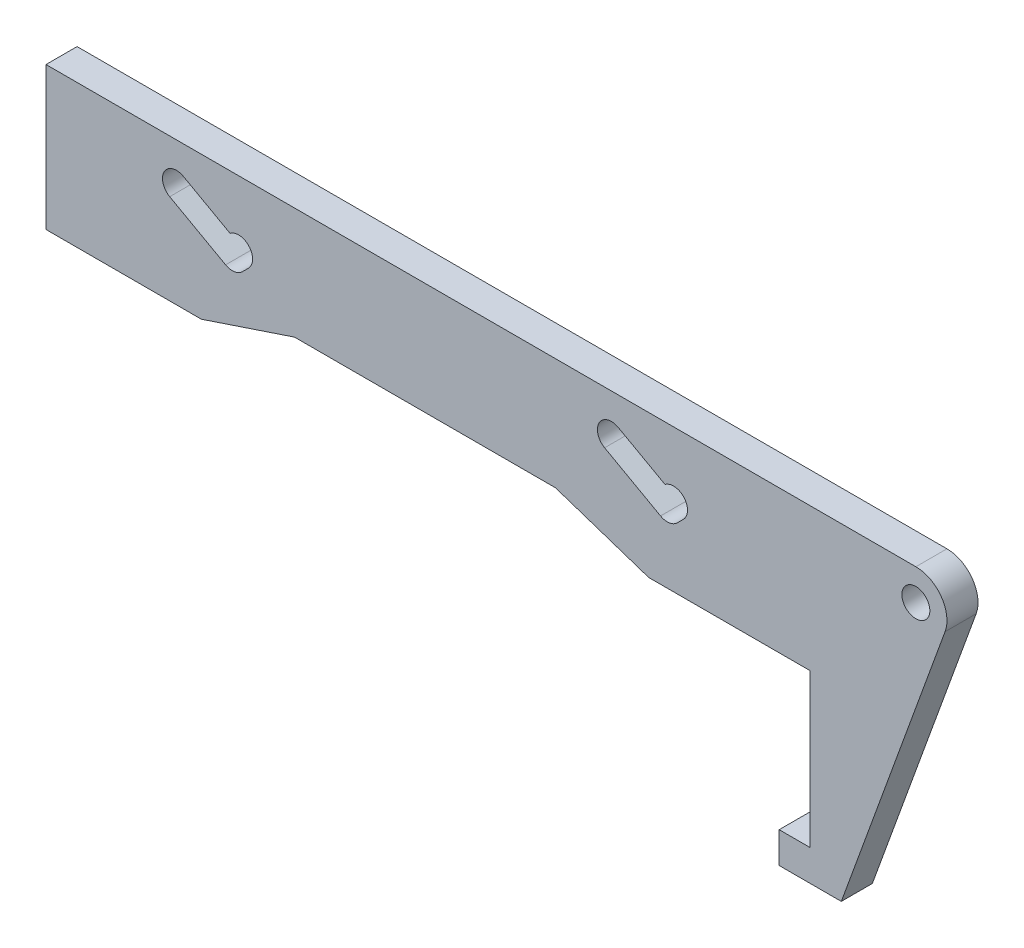
ISO-10303-21;
HEADER;
FILE_DESCRIPTION(('STEP AP214'),'2;1');
FILE_NAME('part.step','',(''),(''),'','','');
FILE_SCHEMA(('AUTOMOTIVE_DESIGN { 1 0 10303 214 1 1 1 1 }'));
ENDSEC;
DATA;
#1=APPLICATION_CONTEXT('core data for automotive mechanical design processes');
#2=APPLICATION_PROTOCOL_DEFINITION('international standard','automotive_design',2000,#1);
#3=PRODUCT_CONTEXT('',#1,'mechanical');
#4=PRODUCT('Part','Part','',(#3));
#5=PRODUCT_RELATED_PRODUCT_CATEGORY('part','',(#4));
#6=PRODUCT_DEFINITION_FORMATION('','',#4);
#7=PRODUCT_DEFINITION_CONTEXT('part definition',#1,'design');
#8=PRODUCT_DEFINITION('design','',#6,#7);
#9=PRODUCT_DEFINITION_SHAPE('','',#8);
#10=(LENGTH_UNIT() NAMED_UNIT(*) SI_UNIT(.MILLI.,.METRE.));
#11=(NAMED_UNIT(*) PLANE_ANGLE_UNIT() SI_UNIT($,.RADIAN.));
#12=(NAMED_UNIT(*) SI_UNIT($,.STERADIAN.) SOLID_ANGLE_UNIT());
#13=UNCERTAINTY_MEASURE_WITH_UNIT(LENGTH_MEASURE(1.E-05),#10,'distance_accuracy_value','');
#14=(GEOMETRIC_REPRESENTATION_CONTEXT(3) GLOBAL_UNCERTAINTY_ASSIGNED_CONTEXT((#13)) GLOBAL_UNIT_ASSIGNED_CONTEXT((#10,
#11,#12)) REPRESENTATION_CONTEXT('',''));
#15=CARTESIAN_POINT('',(0.,0.,0.));
#16=DIRECTION('',(0.,0.,1.));
#17=DIRECTION('',(1.,0.,0.));
#18=AXIS2_PLACEMENT_3D('',#15,#16,#17);
#19=CARTESIAN_POINT('',(0.,-9.,5.));
#20=DIRECTION('',(0.,-1.,0.));
#21=DIRECTION('',(1.,0.,0.));
#22=AXIS2_PLACEMENT_3D('',#19,#20,#21);
#23=PLANE('',#22);
#24=DIRECTION('',(-1.,0.,0.));
#25=VECTOR('',#24,1.);
#26=CARTESIAN_POINT('',(0.,-9.,5.));
#27=LINE('',#26,#25);
#28=CARTESIAN_POINT('',(62.,-8.99999999999999,5.));
#29=VERTEX_POINT('',#28);
#30=CARTESIAN_POINT('',(36.,-8.99999999999999,5.));
#31=VERTEX_POINT('',#30);
#32=EDGE_CURVE('E337',#29,#31,#27,.T.);
#33=ORIENTED_EDGE('',*,*,#32,.T.);
#34=DIRECTION('',(0.,0.,1.));
#35=VECTOR('',#34,1.);
#36=CARTESIAN_POINT('',(36.,-8.99999999999999,0.));
#37=LINE('',#36,#35);
#38=CARTESIAN_POINT('',(36.,-8.99999999999999,0.));
#39=VERTEX_POINT('',#38);
#40=EDGE_CURVE('E420',#39,#31,#37,.T.);
#41=ORIENTED_EDGE('',*,*,#40,.F.);
#42=DIRECTION('',(-1.,0.,0.));
#43=VECTOR('',#42,1.);
#44=CARTESIAN_POINT('',(0.,-9.,0.));
#45=LINE('',#44,#43);
#46=CARTESIAN_POINT('',(62.,-8.99999999999999,0.));
#47=VERTEX_POINT('',#46);
#48=EDGE_CURVE('E230',#47,#39,#45,.T.);
#49=ORIENTED_EDGE('',*,*,#48,.F.);
#50=DIRECTION('',(0.,0.,1.));
#51=VECTOR('',#50,1.);
#52=CARTESIAN_POINT('',(62.,-8.99999999999999,0.));
#53=LINE('',#52,#51);
#54=EDGE_CURVE('E461',#47,#29,#53,.T.);
#55=ORIENTED_EDGE('',*,*,#54,.T.);
#56=EDGE_LOOP('',(#33,#41,#49,#55));
#57=FACE_BOUND('',#56,.T.);
#58=ADVANCED_FACE('F42',(#57),#23,.T.);
#59=CARTESIAN_POINT('',(40.,3.5,5.));
#60=DIRECTION('',(0.,0.,-1.));
#61=DIRECTION('',(-1.,0.,0.));
#62=AXIS2_PLACEMENT_3D('',#59,#60,#61);
#63=CYLINDRICAL_SURFACE('',#62,2.25);
#64=CARTESIAN_POINT('',(40.,3.5,0.));
#65=DIRECTION('',(0.,0.,1.));
#66=DIRECTION('',(1.,0.,0.));
#67=AXIS2_PLACEMENT_3D('',#64,#65,#66);
#68=CIRCLE('',#67,2.25);
#69=CARTESIAN_POINT('',(41.5909902576697,1.90900974233026,0.));
#70=VERTEX_POINT('',#69);
#71=CARTESIAN_POINT('',(38.6259531601398,5.2817113351691,0.));
#72=VERTEX_POINT('',#71);
#73=EDGE_CURVE('E234',#70,#72,#68,.T.);
#74=ORIENTED_EDGE('',*,*,#73,.F.);
#75=DIRECTION('',(0.,0.,-1.));
#76=VECTOR('',#75,1.);
#77=CARTESIAN_POINT('',(41.5909902576697,1.90900974233026,5.));
#78=LINE('',#77,#76);
#79=CARTESIAN_POINT('',(41.5909902576697,1.90900974233026,5.));
#80=VERTEX_POINT('',#79);
#81=EDGE_CURVE('E11',#80,#70,#78,.T.);
#82=ORIENTED_EDGE('',*,*,#81,.F.);
#83=CARTESIAN_POINT('',(40.,3.5,5.));
#84=DIRECTION('',(0.,0.,1.));
#85=DIRECTION('',(1.,0.,0.));
#86=AXIS2_PLACEMENT_3D('',#83,#84,#85);
#87=CIRCLE('',#86,2.25);
#88=CARTESIAN_POINT('',(38.6259531601398,5.2817113351691,5.));
#89=VERTEX_POINT('',#88);
#90=EDGE_CURVE('E341',#80,#89,#87,.T.);
#91=ORIENTED_EDGE('',*,*,#90,.T.);
#92=DIRECTION('',(0.,0.,-1.));
#93=VECTOR('',#92,1.);
#94=CARTESIAN_POINT('',(38.6259531601398,5.2817113351691,5.));
#95=LINE('',#94,#93);
#96=EDGE_CURVE('E120',#89,#72,#95,.T.);
#97=ORIENTED_EDGE('',*,*,#96,.T.);
#98=EDGE_LOOP('',(#74,#82,#91,#97));
#99=FACE_BOUND('',#98,.T.);
#100=ADVANCED_FACE('F357',(#99),#63,.F.);
#101=CARTESIAN_POINT('',(19.8409902576697,-19.8409902576697,5.));
#102=DIRECTION('',(-0.707106781186547,0.707106781186548,0.));
#103=DIRECTION('',(-0.707106781186548,-0.707106781186547,0.));
#104=AXIS2_PLACEMENT_3D('',#101,#102,#103);
#105=PLANE('',#104);
#106=DIRECTION('',(0.707106781186548,0.707106781186547,0.));
#107=VECTOR('',#106,1.);
#108=CARTESIAN_POINT('',(19.8409902576697,-19.8409902576697,0.));
#109=LINE('',#108,#107);
#110=CARTESIAN_POINT('',(40.5909902576697,0.909009742330262,0.));
#111=VERTEX_POINT('',#110);
#112=EDGE_CURVE('E238',#111,#70,#109,.T.);
#113=ORIENTED_EDGE('',*,*,#112,.F.);
#114=DIRECTION('',(0.,0.,-1.));
#115=VECTOR('',#114,1.);
#116=CARTESIAN_POINT('',(40.5909902576697,0.909009742330262,5.));
#117=LINE('',#116,#115);
#118=CARTESIAN_POINT('',(40.5909902576697,0.909009742330262,5.));
#119=VERTEX_POINT('',#118);
#120=EDGE_CURVE('E52',#119,#111,#117,.T.);
#121=ORIENTED_EDGE('',*,*,#120,.F.);
#122=DIRECTION('',(0.707106781186548,0.707106781186547,0.));
#123=VECTOR('',#122,1.);
#124=CARTESIAN_POINT('',(19.8409902576697,-19.8409902576697,5.));
#125=LINE('',#124,#123);
#126=EDGE_CURVE('E344',#119,#80,#125,.T.);
#127=ORIENTED_EDGE('',*,*,#126,.T.);
#128=ORIENTED_EDGE('',*,*,#81,.T.);
#129=EDGE_LOOP('',(#113,#121,#127,#128));
#130=FACE_BOUND('',#129,.T.);
#131=ADVANCED_FACE('F359',(#130),#105,.T.);
#132=CARTESIAN_POINT('',(39.,2.5,5.));
#133=DIRECTION('',(0.,0.,-1.));
#134=DIRECTION('',(-1.,0.,0.));
#135=AXIS2_PLACEMENT_3D('',#132,#133,#134);
#136=CYLINDRICAL_SURFACE('',#135,2.25);
#137=CARTESIAN_POINT('',(39.,2.5,0.));
#138=DIRECTION('',(0.,0.,1.));
#139=DIRECTION('',(1.,0.,0.));
#140=AXIS2_PLACEMENT_3D('',#137,#138,#139);
#141=CIRCLE('',#140,2.25);
#142=CARTESIAN_POINT('',(37.9073034048481,0.533146128726545,0.));
#143=VERTEX_POINT('',#142);
#144=EDGE_CURVE('E242',#143,#111,#141,.T.);
#145=ORIENTED_EDGE('',*,*,#144,.F.);
#146=DIRECTION('',(0.,0.,-1.));
#147=VECTOR('',#146,1.);
#148=CARTESIAN_POINT('',(37.9073034048481,0.533146128726545,5.));
#149=LINE('',#148,#147);
#150=CARTESIAN_POINT('',(37.9073034048481,0.533146128726545,5.));
#151=VERTEX_POINT('',#150);
#152=EDGE_CURVE('E176',#151,#143,#149,.T.);
#153=ORIENTED_EDGE('',*,*,#152,.F.);
#154=CARTESIAN_POINT('',(39.,2.5,5.));
#155=DIRECTION('',(0.,0.,1.));
#156=DIRECTION('',(1.,0.,0.));
#157=AXIS2_PLACEMENT_3D('',#154,#155,#156);
#158=CIRCLE('',#157,2.25);
#159=EDGE_CURVE('E185',#151,#119,#158,.T.);
#160=ORIENTED_EDGE('',*,*,#159,.T.);
#161=ORIENTED_EDGE('',*,*,#120,.T.);
#162=EDGE_LOOP('',(#145,#153,#160,#161));
#163=FACE_BOUND('',#162,.T.);
#164=ADVANCED_FACE('F350',(#163),#136,.F.);
#165=CARTESIAN_POINT('',(9.16673736711222,16.500127260802,5.));
#166=DIRECTION('',(0.485642931178632,0.874157276121538,0.));
#167=DIRECTION('',(-0.874157276121538,0.485642931178632,0.));
#168=AXIS2_PLACEMENT_3D('',#165,#166,#167);
#169=PLANE('',#168);
#170=DIRECTION('',(0.874157276121538,-0.485642931178632,0.));
#171=VECTOR('',#170,1.);
#172=CARTESIAN_POINT('',(9.16673736711222,16.500127260802,0.));
#173=LINE('',#172,#171);
#174=CARTESIAN_POINT('',(28.9073034048481,5.53314612872654,0.));
#175=VERTEX_POINT('',#174);
#176=EDGE_CURVE('E170',#175,#143,#173,.T.);
#177=ORIENTED_EDGE('',*,*,#176,.F.);
#178=DIRECTION('',(0.,0.,-1.));
#179=VECTOR('',#178,1.);
#180=CARTESIAN_POINT('',(28.9073034048481,5.53314612872654,5.));
#181=LINE('',#180,#179);
#182=CARTESIAN_POINT('',(28.9073034048481,5.53314612872654,5.));
#183=VERTEX_POINT('',#182);
#184=EDGE_CURVE('E165',#183,#175,#181,.T.);
#185=ORIENTED_EDGE('',*,*,#184,.F.);
#186=DIRECTION('',(0.874157276121538,-0.485642931178632,0.));
#187=VECTOR('',#186,1.);
#188=CARTESIAN_POINT('',(9.16673736711222,16.500127260802,5.));
#189=LINE('',#188,#187);
#190=EDGE_CURVE('E168',#183,#151,#189,.T.);
#191=ORIENTED_EDGE('',*,*,#190,.T.);
#192=ORIENTED_EDGE('',*,*,#152,.T.);
#193=EDGE_LOOP('',(#177,#185,#191,#192));
#194=FACE_BOUND('',#193,.T.);
#195=ADVANCED_FACE('F167',(#194),#169,.T.);
#196=CARTESIAN_POINT('',(30.,7.5,5.));
#197=DIRECTION('',(0.,0.,-1.));
#198=DIRECTION('',(-1.,0.,0.));
#199=AXIS2_PLACEMENT_3D('',#196,#197,#198);
#200=CYLINDRICAL_SURFACE('',#199,2.25);
#201=CARTESIAN_POINT('',(30.,7.5,0.));
#202=DIRECTION('',(0.,0.,1.));
#203=DIRECTION('',(1.,0.,0.));
#204=AXIS2_PLACEMENT_3D('',#201,#202,#203);
#205=CIRCLE('',#204,2.25);
#206=CARTESIAN_POINT('',(31.0926965951519,9.46685387127346,0.));
#207=VERTEX_POINT('',#206);
#208=EDGE_CURVE('E248',#207,#175,#205,.T.);
#209=ORIENTED_EDGE('',*,*,#208,.F.);
#210=DIRECTION('',(0.,0.,-1.));
#211=VECTOR('',#210,1.);
#212=CARTESIAN_POINT('',(31.0926965951519,9.46685387127346,5.));
#213=LINE('',#212,#211);
#214=CARTESIAN_POINT('',(31.0926965951519,9.46685387127346,5.));
#215=VERTEX_POINT('',#214);
#216=EDGE_CURVE('E177',#215,#207,#213,.T.);
#217=ORIENTED_EDGE('',*,*,#216,.F.);
#218=CARTESIAN_POINT('',(30.,7.5,5.));
#219=DIRECTION('',(0.,0.,1.));
#220=DIRECTION('',(1.,0.,0.));
#221=AXIS2_PLACEMENT_3D('',#218,#219,#220);
#222=CIRCLE('',#221,2.25);
#223=EDGE_CURVE('E182',#215,#183,#222,.T.);
#224=ORIENTED_EDGE('',*,*,#223,.T.);
#225=ORIENTED_EDGE('',*,*,#184,.T.);
#226=EDGE_LOOP('',(#209,#217,#224,#225));
#227=FACE_BOUND('',#226,.T.);
#228=ADVANCED_FACE('F188',(#227),#200,.F.);
#229=CARTESIAN_POINT('',(0.,14.,5.));
#230=DIRECTION('',(0.,-1.,0.));
#231=DIRECTION('',(0.,0.,-1.));
#232=AXIS2_PLACEMENT_3D('',#229,#230,#231);
#233=PLANE('',#232);
#234=DIRECTION('',(-1.,0.,0.));
#235=VECTOR('',#234,1.);
#236=CARTESIAN_POINT('',(0.,14.,0.));
#237=LINE('',#236,#235);
#238=CARTESIAN_POINT('',(79.,14.,0.));
#239=VERTEX_POINT('',#238);
#240=CARTESIAN_POINT('',(-61.,14.,0.));
#241=VERTEX_POINT('',#240);
#242=EDGE_CURVE('E221',#239,#241,#237,.T.);
#243=ORIENTED_EDGE('',*,*,#242,.T.);
#244=DIRECTION('',(0.,0.,-1.));
#245=VECTOR('',#244,1.);
#246=CARTESIAN_POINT('',(-61.,14.,5.));
#247=LINE('',#246,#245);
#248=CARTESIAN_POINT('',(-61.,14.,5.));
#249=VERTEX_POINT('',#248);
#250=EDGE_CURVE('E257',#249,#241,#247,.T.);
#251=ORIENTED_EDGE('',*,*,#250,.F.);
#252=DIRECTION('',(-1.,0.,0.));
#253=VECTOR('',#252,1.);
#254=CARTESIAN_POINT('',(0.,14.,5.));
#255=LINE('',#254,#253);
#256=CARTESIAN_POINT('',(79.,14.,5.));
#257=VERTEX_POINT('',#256);
#258=EDGE_CURVE('E329',#257,#249,#255,.T.);
#259=ORIENTED_EDGE('',*,*,#258,.F.);
#260=DIRECTION('',(0.,0.,1.));
#261=VECTOR('',#260,1.);
#262=CARTESIAN_POINT('',(79.,14.,0.));
#263=LINE('',#262,#261);
#264=EDGE_CURVE('E465',#239,#257,#263,.T.);
#265=ORIENTED_EDGE('',*,*,#264,.F.);
#266=EDGE_LOOP('',(#243,#251,#259,#265));
#267=FACE_BOUND('',#266,.T.);
#268=ADVANCED_FACE('F382',(#267),#233,.F.);
#269=CARTESIAN_POINT('',(-61.,0.,5.));
#270=DIRECTION('',(-1.,0.,0.));
#271=DIRECTION('',(0.,0.,1.));
#272=AXIS2_PLACEMENT_3D('',#269,#270,#271);
#273=PLANE('',#272);
#274=DIRECTION('',(0.,1.,0.));
#275=VECTOR('',#274,1.);
#276=CARTESIAN_POINT('',(-61.,0.,0.));
#277=LINE('',#276,#275);
#278=CARTESIAN_POINT('',(-61.,-9.00000000000001,0.));
#279=VERTEX_POINT('',#278);
#280=EDGE_CURVE('E225',#279,#241,#277,.T.);
#281=ORIENTED_EDGE('',*,*,#280,.F.);
#282=DIRECTION('',(0.,0.,-1.));
#283=VECTOR('',#282,1.);
#284=CARTESIAN_POINT('',(-61.,-9.00000000000001,5.));
#285=LINE('',#284,#283);
#286=CARTESIAN_POINT('',(-61.,-9.00000000000001,5.));
#287=VERTEX_POINT('',#286);
#288=EDGE_CURVE('E264',#287,#279,#285,.T.);
#289=ORIENTED_EDGE('',*,*,#288,.F.);
#290=DIRECTION('',(0.,1.,0.));
#291=VECTOR('',#290,1.);
#292=CARTESIAN_POINT('',(-61.,0.,5.));
#293=LINE('',#292,#291);
#294=EDGE_CURVE('E332',#287,#249,#293,.T.);
#295=ORIENTED_EDGE('',*,*,#294,.T.);
#296=ORIENTED_EDGE('',*,*,#250,.T.);
#297=EDGE_LOOP('',(#281,#289,#295,#296));
#298=FACE_BOUND('',#297,.T.);
#299=ADVANCED_FACE('F376',(#298),#273,.T.);
#300=DIRECTION('',(0.,0.,1.));
#301=VECTOR('',#300,1.);
#302=CARTESIAN_POINT('',(-36.,-9.,0.));
#303=LINE('',#302,#301);
#304=CARTESIAN_POINT('',(-36.,-9.,0.));
#305=VERTEX_POINT('',#304);
#306=CARTESIAN_POINT('',(-36.,-9.,5.));
#307=VERTEX_POINT('',#306);
#308=EDGE_CURVE('E201',#305,#307,#303,.T.);
#309=ORIENTED_EDGE('',*,*,#308,.T.);
#310=EDGE_CURVE('E336',#307,#287,#27,.T.);
#311=ORIENTED_EDGE('',*,*,#310,.T.);
#312=ORIENTED_EDGE('',*,*,#288,.T.);
#313=EDGE_CURVE('E229',#305,#279,#45,.T.);
#314=ORIENTED_EDGE('',*,*,#313,.F.);
#315=EDGE_LOOP('',(#309,#311,#312,#314));
#316=FACE_BOUND('',#315,.T.);
#317=ADVANCED_FACE('F371',(#316),#23,.T.);
#318=CARTESIAN_POINT('',(-40.,7.5,5.));
#319=DIRECTION('',(0.,0.,-1.));
#320=DIRECTION('',(-1.,0.,0.));
#321=AXIS2_PLACEMENT_3D('',#318,#319,#320);
#322=CYLINDRICAL_SURFACE('',#321,2.25);
#323=CARTESIAN_POINT('',(-40.,7.5,0.));
#324=DIRECTION('',(0.,0.,1.));
#325=DIRECTION('',(1.,0.,0.));
#326=AXIS2_PLACEMENT_3D('',#323,#324,#325);
#327=CIRCLE('',#326,2.25);
#328=CARTESIAN_POINT('',(-38.9073034048481,9.46685387127346,0.));
#329=VERTEX_POINT('',#328);
#330=CARTESIAN_POINT('',(-41.0926965951519,5.53314612872654,0.));
#331=VERTEX_POINT('',#330);
#332=EDGE_CURVE('E196',#329,#331,#327,.T.);
#333=ORIENTED_EDGE('',*,*,#332,.F.);
#334=DIRECTION('',(0.,0.,-1.));
#335=VECTOR('',#334,1.);
#336=CARTESIAN_POINT('',(-38.9073034048481,9.46685387127346,5.));
#337=LINE('',#336,#335);
#338=CARTESIAN_POINT('',(-38.9073034048481,9.46685387127346,5.));
#339=VERTEX_POINT('',#338);
#340=EDGE_CURVE('E46',#339,#329,#337,.T.);
#341=ORIENTED_EDGE('',*,*,#340,.F.);
#342=CARTESIAN_POINT('',(-40.,7.5,5.));
#343=DIRECTION('',(0.,0.,1.));
#344=DIRECTION('',(1.,0.,0.));
#345=AXIS2_PLACEMENT_3D('',#342,#343,#344);
#346=CIRCLE('',#345,2.25);
#347=CARTESIAN_POINT('',(-41.0926965951519,5.53314612872654,5.));
#348=VERTEX_POINT('',#347);
#349=EDGE_CURVE('E254',#339,#348,#346,.T.);
#350=ORIENTED_EDGE('',*,*,#349,.T.);
#351=DIRECTION('',(0.,0.,-1.));
#352=VECTOR('',#351,1.);
#353=CARTESIAN_POINT('',(-41.0926965951519,5.53314612872654,5.));
#354=LINE('',#353,#352);
#355=EDGE_CURVE('E192',#348,#331,#354,.T.);
#356=ORIENTED_EDGE('',*,*,#355,.T.);
#357=EDGE_LOOP('',(#333,#341,#350,#356));
#358=FACE_BOUND('',#357,.T.);
#359=ADVANCED_FACE('F44',(#358),#322,.F.);
#360=CARTESIAN_POINT('',(-5.15730340484807,-9.28314612872654,5.));
#361=DIRECTION('',(0.485642931178632,0.874157276121538,0.));
#362=DIRECTION('',(-0.874157276121538,0.485642931178632,0.));
#363=AXIS2_PLACEMENT_3D('',#360,#361,#362);
#364=PLANE('',#363);
#365=DIRECTION('',(0.874157276121538,-0.485642931178632,0.));
#366=VECTOR('',#365,1.);
#367=CARTESIAN_POINT('',(-5.15730340484807,-9.28314612872654,0.));
#368=LINE('',#367,#366);
#369=CARTESIAN_POINT('',(-31.3740468398602,5.2817113351691,0.));
#370=VERTEX_POINT('',#369);
#371=EDGE_CURVE('E200',#329,#370,#368,.T.);
#372=ORIENTED_EDGE('',*,*,#371,.T.);
#373=DIRECTION('',(0.,0.,-1.));
#374=VECTOR('',#373,1.);
#375=CARTESIAN_POINT('',(-31.3740468398602,5.2817113351691,5.));
#376=LINE('',#375,#374);
#377=CARTESIAN_POINT('',(-31.3740468398602,5.2817113351691,5.));
#378=VERTEX_POINT('',#377);
#379=EDGE_CURVE('E280',#378,#370,#376,.T.);
#380=ORIENTED_EDGE('',*,*,#379,.F.);
#381=DIRECTION('',(0.874157276121538,-0.485642931178632,0.));
#382=VECTOR('',#381,1.);
#383=CARTESIAN_POINT('',(-5.15730340484807,-9.28314612872654,5.));
#384=LINE('',#383,#382);
#385=EDGE_CURVE('E290',#339,#378,#384,.T.);
#386=ORIENTED_EDGE('',*,*,#385,.F.);
#387=ORIENTED_EDGE('',*,*,#340,.T.);
#388=EDGE_LOOP('',(#372,#380,#386,#387));
#389=FACE_BOUND('',#388,.T.);
#390=ADVANCED_FACE('F289',(#389),#364,.F.);
#391=CARTESIAN_POINT('',(-30.,3.5,5.));
#392=DIRECTION('',(0.,0.,-1.));
#393=DIRECTION('',(-1.,0.,0.));
#394=AXIS2_PLACEMENT_3D('',#391,#392,#393);
#395=CYLINDRICAL_SURFACE('',#394,2.25);
#396=CARTESIAN_POINT('',(-30.,3.5,0.));
#397=DIRECTION('',(0.,0.,1.));
#398=DIRECTION('',(1.,0.,0.));
#399=AXIS2_PLACEMENT_3D('',#396,#397,#398);
#400=CIRCLE('',#399,2.25);
#401=CARTESIAN_POINT('',(-28.4090097423303,1.90900974233026,0.));
#402=VERTEX_POINT('',#401);
#403=EDGE_CURVE('E205',#402,#370,#400,.T.);
#404=ORIENTED_EDGE('',*,*,#403,.F.);
#405=DIRECTION('',(0.,0.,-1.));
#406=VECTOR('',#405,1.);
#407=CARTESIAN_POINT('',(-28.4090097423303,1.90900974233026,5.));
#408=LINE('',#407,#406);
#409=CARTESIAN_POINT('',(-28.4090097423303,1.90900974233026,5.));
#410=VERTEX_POINT('',#409);
#411=EDGE_CURVE('E278',#410,#402,#408,.T.);
#412=ORIENTED_EDGE('',*,*,#411,.F.);
#413=CARTESIAN_POINT('',(-30.,3.5,5.));
#414=DIRECTION('',(0.,0.,1.));
#415=DIRECTION('',(1.,0.,0.));
#416=AXIS2_PLACEMENT_3D('',#413,#414,#415);
#417=CIRCLE('',#416,2.25);
#418=EDGE_CURVE('E313',#410,#378,#417,.T.);
#419=ORIENTED_EDGE('',*,*,#418,.T.);
#420=ORIENTED_EDGE('',*,*,#379,.T.);
#421=EDGE_LOOP('',(#404,#412,#419,#420));
#422=FACE_BOUND('',#421,.T.);
#423=ADVANCED_FACE('F311',(#422),#395,.F.);
#424=CARTESIAN_POINT('',(-15.1590097423303,15.1590097423303,5.));
#425=DIRECTION('',(0.707106781186547,-0.707106781186548,0.));
#426=DIRECTION('',(0.707106781186548,0.707106781186547,0.));
#427=AXIS2_PLACEMENT_3D('',#424,#425,#426);
#428=PLANE('',#427);
#429=DIRECTION('',(-0.707106781186548,-0.707106781186547,0.));
#430=VECTOR('',#429,1.);
#431=CARTESIAN_POINT('',(-15.1590097423303,15.1590097423303,0.));
#432=LINE('',#431,#430);
#433=CARTESIAN_POINT('',(-29.4090097423303,0.909009742330266,0.));
#434=VERTEX_POINT('',#433);
#435=EDGE_CURVE('E209',#402,#434,#432,.T.);
#436=ORIENTED_EDGE('',*,*,#435,.T.);
#437=DIRECTION('',(0.,0.,-1.));
#438=VECTOR('',#437,1.);
#439=CARTESIAN_POINT('',(-29.4090097423303,0.909009742330266,5.));
#440=LINE('',#439,#438);
#441=CARTESIAN_POINT('',(-29.4090097423303,0.909009742330266,5.));
#442=VERTEX_POINT('',#441);
#443=EDGE_CURVE('E275',#442,#434,#440,.T.);
#444=ORIENTED_EDGE('',*,*,#443,.F.);
#445=DIRECTION('',(-0.707106781186548,-0.707106781186547,0.));
#446=VECTOR('',#445,1.);
#447=CARTESIAN_POINT('',(-15.1590097423303,15.1590097423303,5.));
#448=LINE('',#447,#446);
#449=EDGE_CURVE('E314',#410,#442,#448,.T.);
#450=ORIENTED_EDGE('',*,*,#449,.F.);
#451=ORIENTED_EDGE('',*,*,#411,.T.);
#452=EDGE_LOOP('',(#436,#444,#450,#451));
#453=FACE_BOUND('',#452,.T.);
#454=ADVANCED_FACE('F310',(#453),#428,.F.);
#455=CARTESIAN_POINT('',(-31.,2.5,5.));
#456=DIRECTION('',(0.,0.,-1.));
#457=DIRECTION('',(-1.,0.,0.));
#458=AXIS2_PLACEMENT_3D('',#455,#456,#457);
#459=CYLINDRICAL_SURFACE('',#458,2.25);
#460=CARTESIAN_POINT('',(-31.,2.5,0.));
#461=DIRECTION('',(0.,0.,1.));
#462=DIRECTION('',(1.,0.,0.));
#463=AXIS2_PLACEMENT_3D('',#460,#461,#462);
#464=CIRCLE('',#463,2.25);
#465=CARTESIAN_POINT('',(-32.0926965951519,0.533146128726535,0.));
#466=VERTEX_POINT('',#465);
#467=EDGE_CURVE('E213',#466,#434,#464,.T.);
#468=ORIENTED_EDGE('',*,*,#467,.F.);
#469=DIRECTION('',(0.,0.,-1.));
#470=VECTOR('',#469,1.);
#471=CARTESIAN_POINT('',(-32.0926965951519,0.533146128726535,5.));
#472=LINE('',#471,#470);
#473=CARTESIAN_POINT('',(-32.0926965951519,0.533146128726535,5.));
#474=VERTEX_POINT('',#473);
#475=EDGE_CURVE('E272',#474,#466,#472,.T.);
#476=ORIENTED_EDGE('',*,*,#475,.F.);
#477=CARTESIAN_POINT('',(-31.,2.5,5.));
#478=DIRECTION('',(0.,0.,1.));
#479=DIRECTION('',(1.,0.,0.));
#480=AXIS2_PLACEMENT_3D('',#477,#478,#479);
#481=CIRCLE('',#480,2.25);
#482=EDGE_CURVE('E307',#474,#442,#481,.T.);
#483=ORIENTED_EDGE('',*,*,#482,.T.);
#484=ORIENTED_EDGE('',*,*,#443,.T.);
#485=EDGE_LOOP('',(#468,#476,#483,#484));
#486=FACE_BOUND('',#485,.T.);
#487=ADVANCED_FACE('F303',(#486),#459,.F.);
#488=CARTESIAN_POINT('',(-7.34269659515192,-13.2168538712735,5.));
#489=DIRECTION('',(-0.485642931178632,-0.874157276121538,0.));
#490=DIRECTION('',(0.874157276121538,-0.485642931178632,0.));
#491=AXIS2_PLACEMENT_3D('',#488,#489,#490);
#492=PLANE('',#491);
#493=DIRECTION('',(-0.874157276121538,0.485642931178632,0.));
#494=VECTOR('',#493,1.);
#495=CARTESIAN_POINT('',(-7.34269659515192,-13.2168538712735,0.));
#496=LINE('',#495,#494);
#497=EDGE_CURVE('E217',#466,#331,#496,.T.);
#498=ORIENTED_EDGE('',*,*,#497,.T.);
#499=ORIENTED_EDGE('',*,*,#355,.F.);
#500=DIRECTION('',(-0.874157276121538,0.485642931178632,0.));
#501=VECTOR('',#500,1.);
#502=CARTESIAN_POINT('',(-7.34269659515192,-13.2168538712735,5.));
#503=LINE('',#502,#501);
#504=EDGE_CURVE('E326',#474,#348,#503,.T.);
#505=ORIENTED_EDGE('',*,*,#504,.F.);
#506=ORIENTED_EDGE('',*,*,#475,.T.);
#507=EDGE_LOOP('',(#498,#499,#505,#506));
#508=FACE_BOUND('',#507,.T.);
#509=ADVANCED_FACE('F300',(#508),#492,.F.);
#510=CARTESIAN_POINT('',(11.3521305574161,20.4338350033489,5.));
#511=DIRECTION('',(0.485642931178632,0.874157276121538,0.));
#512=DIRECTION('',(-0.874157276121538,0.485642931178632,0.));
#513=AXIS2_PLACEMENT_3D('',#510,#511,#512);
#514=PLANE('',#513);
#515=DIRECTION('',(0.874157276121538,-0.485642931178632,0.));
#516=VECTOR('',#515,1.);
#517=CARTESIAN_POINT('',(11.3521305574161,20.4338350033489,0.));
#518=LINE('',#517,#516);
#519=EDGE_CURVE('E251',#207,#72,#518,.T.);
#520=ORIENTED_EDGE('',*,*,#519,.T.);
#521=ORIENTED_EDGE('',*,*,#96,.F.);
#522=DIRECTION('',(0.874157276121538,-0.485642931178632,0.));
#523=VECTOR('',#522,1.);
#524=CARTESIAN_POINT('',(11.3521305574161,20.4338350033489,5.));
#525=LINE('',#524,#523);
#526=EDGE_CURVE('E69',#215,#89,#525,.T.);
#527=ORIENTED_EDGE('',*,*,#526,.F.);
#528=ORIENTED_EDGE('',*,*,#216,.T.);
#529=EDGE_LOOP('',(#520,#521,#527,#528));
#530=FACE_BOUND('',#529,.T.);
#531=ADVANCED_FACE('F356',(#530),#514,.F.);
#532=CARTESIAN_POINT('',(0.,0.,5.));
#533=DIRECTION('',(0.,0.,1.));
#534=DIRECTION('',(1.,0.,0.));
#535=AXIS2_PLACEMENT_3D('',#532,#533,#534);
#536=PLANE('',#535);
#537=DIRECTION('',(-0.948683298050514,-0.316227766016838,0.));
#538=VECTOR('',#537,1.);
#539=CARTESIAN_POINT('',(-0.900000000000002,2.70000000000001,5.));
#540=LINE('',#539,#538);
#541=CARTESIAN_POINT('',(-21.,-3.99999999999999,5.));
#542=VERTEX_POINT('',#541);
#543=EDGE_CURVE('E402',#542,#307,#540,.T.);
#544=ORIENTED_EDGE('',*,*,#543,.F.);
#545=DIRECTION('',(1.,0.,0.));
#546=VECTOR('',#545,1.);
#547=CARTESIAN_POINT('',(0.,-3.99999999999999,5.));
#548=LINE('',#547,#546);
#549=CARTESIAN_POINT('',(21.,-3.99999999999999,5.));
#550=VERTEX_POINT('',#549);
#551=EDGE_CURVE('E434',#542,#550,#548,.T.);
#552=ORIENTED_EDGE('',*,*,#551,.T.);
#553=DIRECTION('',(0.948683298050514,-0.316227766016838,0.));
#554=VECTOR('',#553,1.);
#555=CARTESIAN_POINT('',(0.900000000000003,2.70000000000001,5.));
#556=LINE('',#555,#554);
#557=EDGE_CURVE('E437',#550,#31,#556,.T.);
#558=ORIENTED_EDGE('',*,*,#557,.T.);
#559=ORIENTED_EDGE('',*,*,#32,.F.);
#560=DIRECTION('',(0.,1.,0.));
#561=VECTOR('',#560,1.);
#562=CARTESIAN_POINT('',(62.,0.,5.));
#563=LINE('',#562,#561);
#564=CARTESIAN_POINT('',(62.,-33.65,5.));
#565=VERTEX_POINT('',#564);
#566=EDGE_CURVE('E513',#565,#29,#563,.T.);
#567=ORIENTED_EDGE('',*,*,#566,.F.);
#568=DIRECTION('',(1.,0.,0.));
#569=VECTOR('',#568,1.);
#570=CARTESIAN_POINT('',(0.,-33.65,5.));
#571=LINE('',#570,#569);
#572=CARTESIAN_POINT('',(57.,-33.65,5.));
#573=VERTEX_POINT('',#572);
#574=EDGE_CURVE('E509',#573,#565,#571,.T.);
#575=ORIENTED_EDGE('',*,*,#574,.F.);
#576=DIRECTION('',(0.,1.,0.));
#577=VECTOR('',#576,1.);
#578=CARTESIAN_POINT('',(57.,0.,5.));
#579=LINE('',#578,#577);
#580=CARTESIAN_POINT('',(57.,-38.65,5.));
#581=VERTEX_POINT('',#580);
#582=EDGE_CURVE('E505',#581,#573,#579,.T.);
#583=ORIENTED_EDGE('',*,*,#582,.F.);
#584=DIRECTION('',(1.,0.,0.));
#585=VECTOR('',#584,1.);
#586=CARTESIAN_POINT('',(0.,-38.65,5.));
#587=LINE('',#586,#585);
#588=CARTESIAN_POINT('',(67.,-38.65,5.));
#589=VERTEX_POINT('',#588);
#590=EDGE_CURVE('E501',#581,#589,#587,.T.);
#591=ORIENTED_EDGE('',*,*,#590,.T.);
#592=DIRECTION('',(0.341617403955507,0.939839108206665,0.));
#593=VECTOR('',#592,1.);
#594=CARTESIAN_POINT('',(71.5901133703618,-26.021931269842,5.));
#595=LINE('',#594,#593);
#596=CARTESIAN_POINT('',(83.6991955410333,7.29191298022245,5.));
#597=VERTEX_POINT('',#596);
#598=EDGE_CURVE('E497',#589,#597,#595,.T.);
#599=ORIENTED_EDGE('',*,*,#598,.T.);
#600=CARTESIAN_POINT('',(79.,8.99999999999999,5.));
#601=DIRECTION('',(0.,0.,1.));
#602=DIRECTION('',(1.,0.,0.));
#603=AXIS2_PLACEMENT_3D('',#600,#601,#602);
#604=CIRCLE('',#603,5.);
#605=EDGE_CURVE('E517',#597,#257,#604,.T.);
#606=ORIENTED_EDGE('',*,*,#605,.T.);
#607=ORIENTED_EDGE('',*,*,#258,.T.);
#608=ORIENTED_EDGE('',*,*,#294,.F.);
#609=ORIENTED_EDGE('',*,*,#310,.F.);
#610=EDGE_LOOP('',(#544,#552,#558,#559,#567,#575,#583,#591,#599,#606,#607,#608,#609));
#611=FACE_BOUND('',#610,.T.);
#612=ORIENTED_EDGE('',*,*,#349,.F.);
#613=ORIENTED_EDGE('',*,*,#385,.T.);
#614=ORIENTED_EDGE('',*,*,#418,.F.);
#615=ORIENTED_EDGE('',*,*,#449,.T.);
#616=ORIENTED_EDGE('',*,*,#482,.F.);
#617=ORIENTED_EDGE('',*,*,#504,.T.);
#618=EDGE_LOOP('',(#612,#613,#614,#615,#616,#617));
#619=FACE_BOUND('',#618,.T.);
#620=ORIENTED_EDGE('',*,*,#90,.F.);
#621=ORIENTED_EDGE('',*,*,#126,.F.);
#622=ORIENTED_EDGE('',*,*,#159,.F.);
#623=ORIENTED_EDGE('',*,*,#190,.F.);
#624=ORIENTED_EDGE('',*,*,#223,.F.);
#625=ORIENTED_EDGE('',*,*,#526,.T.);
#626=EDGE_LOOP('',(#620,#621,#622,#623,#624,#625));
#627=FACE_BOUND('',#626,.T.);
#628=CARTESIAN_POINT('',(79.,8.99999999999999,5.));
#629=DIRECTION('',(0.,0.,1.));
#630=DIRECTION('',(1.,0.,0.));
#631=AXIS2_PLACEMENT_3D('',#628,#629,#630);
#632=CIRCLE('',#631,2.25);
#633=CARTESIAN_POINT('',(81.25,8.99999999999999,5.));
#634=VERTEX_POINT('',#633);
#635=EDGE_CURVE('E520',#634,#634,#632,.T.);
#636=ORIENTED_EDGE('',*,*,#635,.F.);
#637=EDGE_LOOP('',(#636));
#638=FACE_BOUND('',#637,.T.);
#639=ADVANCED_FACE('F180',(#611,#619,#627,#638),#536,.T.);
#640=CARTESIAN_POINT('',(0.,0.,0.));
#641=DIRECTION('',(0.,0.,1.));
#642=DIRECTION('',(1.,0.,0.));
#643=AXIS2_PLACEMENT_3D('',#640,#641,#642);
#644=PLANE('',#643);
#645=ORIENTED_EDGE('',*,*,#332,.T.);
#646=ORIENTED_EDGE('',*,*,#497,.F.);
#647=ORIENTED_EDGE('',*,*,#467,.T.);
#648=ORIENTED_EDGE('',*,*,#435,.F.);
#649=ORIENTED_EDGE('',*,*,#403,.T.);
#650=ORIENTED_EDGE('',*,*,#371,.F.);
#651=EDGE_LOOP('',(#645,#646,#647,#648,#649,#650));
#652=FACE_BOUND('',#651,.T.);
#653=DIRECTION('',(1.,0.,0.));
#654=VECTOR('',#653,1.);
#655=CARTESIAN_POINT('',(0.,-3.99999999999999,0.));
#656=LINE('',#655,#654);
#657=CARTESIAN_POINT('',(-21.,-3.99999999999999,0.));
#658=VERTEX_POINT('',#657);
#659=CARTESIAN_POINT('',(21.,-3.99999999999999,0.));
#660=VERTEX_POINT('',#659);
#661=EDGE_CURVE('E426',#658,#660,#656,.T.);
#662=ORIENTED_EDGE('',*,*,#661,.F.);
#663=DIRECTION('',(-0.948683298050514,-0.316227766016838,0.));
#664=VECTOR('',#663,1.);
#665=CARTESIAN_POINT('',(-0.900000000000002,2.70000000000001,0.));
#666=LINE('',#665,#664);
#667=EDGE_CURVE('E413',#658,#305,#666,.T.);
#668=ORIENTED_EDGE('',*,*,#667,.T.);
#669=ORIENTED_EDGE('',*,*,#313,.T.);
#670=ORIENTED_EDGE('',*,*,#280,.T.);
#671=ORIENTED_EDGE('',*,*,#242,.F.);
#672=CARTESIAN_POINT('',(79.,8.99999999999999,0.));
#673=DIRECTION('',(0.,0.,1.));
#674=DIRECTION('',(1.,0.,0.));
#675=AXIS2_PLACEMENT_3D('',#672,#673,#674);
#676=CIRCLE('',#675,5.);
#677=CARTESIAN_POINT('',(83.6991955410333,7.29191298022245,0.));
#678=VERTEX_POINT('',#677);
#679=EDGE_CURVE('E489',#678,#239,#676,.T.);
#680=ORIENTED_EDGE('',*,*,#679,.F.);
#681=DIRECTION('',(0.341617403955507,0.939839108206665,0.));
#682=VECTOR('',#681,1.);
#683=CARTESIAN_POINT('',(71.5901133703618,-26.021931269842,0.));
#684=LINE('',#683,#682);
#685=CARTESIAN_POINT('',(67.,-38.65,0.));
#686=VERTEX_POINT('',#685);
#687=EDGE_CURVE('E469',#686,#678,#684,.T.);
#688=ORIENTED_EDGE('',*,*,#687,.F.);
#689=DIRECTION('',(1.,0.,0.));
#690=VECTOR('',#689,1.);
#691=CARTESIAN_POINT('',(0.,-38.65,0.));
#692=LINE('',#691,#690);
#693=CARTESIAN_POINT('',(57.,-38.65,0.));
#694=VERTEX_POINT('',#693);
#695=EDGE_CURVE('E473',#694,#686,#692,.T.);
#696=ORIENTED_EDGE('',*,*,#695,.F.);
#697=DIRECTION('',(0.,1.,0.));
#698=VECTOR('',#697,1.);
#699=CARTESIAN_POINT('',(57.,0.,0.));
#700=LINE('',#699,#698);
#701=CARTESIAN_POINT('',(57.,-33.65,0.));
#702=VERTEX_POINT('',#701);
#703=EDGE_CURVE('E477',#694,#702,#700,.T.);
#704=ORIENTED_EDGE('',*,*,#703,.T.);
#705=DIRECTION('',(1.,0.,0.));
#706=VECTOR('',#705,1.);
#707=CARTESIAN_POINT('',(0.,-33.65,0.));
#708=LINE('',#707,#706);
#709=CARTESIAN_POINT('',(62.,-33.65,0.));
#710=VERTEX_POINT('',#709);
#711=EDGE_CURVE('E481',#702,#710,#708,.T.);
#712=ORIENTED_EDGE('',*,*,#711,.T.);
#713=DIRECTION('',(0.,1.,0.));
#714=VECTOR('',#713,1.);
#715=CARTESIAN_POINT('',(62.,0.,0.));
#716=LINE('',#715,#714);
#717=EDGE_CURVE('E485',#710,#47,#716,.T.);
#718=ORIENTED_EDGE('',*,*,#717,.T.);
#719=ORIENTED_EDGE('',*,*,#48,.T.);
#720=DIRECTION('',(0.948683298050514,-0.316227766016838,0.));
#721=VECTOR('',#720,1.);
#722=CARTESIAN_POINT('',(0.900000000000003,2.70000000000001,0.));
#723=LINE('',#722,#721);
#724=EDGE_CURVE('E429',#660,#39,#723,.T.);
#725=ORIENTED_EDGE('',*,*,#724,.F.);
#726=EDGE_LOOP('',(#662,#668,#669,#670,#671,#680,#688,#696,#704,#712,#718,#719,#725));
#727=FACE_BOUND('',#726,.T.);
#728=ORIENTED_EDGE('',*,*,#73,.T.);
#729=ORIENTED_EDGE('',*,*,#519,.F.);
#730=ORIENTED_EDGE('',*,*,#208,.T.);
#731=ORIENTED_EDGE('',*,*,#176,.T.);
#732=ORIENTED_EDGE('',*,*,#144,.T.);
#733=ORIENTED_EDGE('',*,*,#112,.T.);
#734=EDGE_LOOP('',(#728,#729,#730,#731,#732,#733));
#735=FACE_BOUND('',#734,.T.);
#736=CARTESIAN_POINT('',(79.,8.99999999999999,0.));
#737=DIRECTION('',(0.,0.,1.));
#738=DIRECTION('',(1.,0.,0.));
#739=AXIS2_PLACEMENT_3D('',#736,#737,#738);
#740=CIRCLE('',#739,2.25);
#741=CARTESIAN_POINT('',(81.25,8.99999999999999,0.));
#742=VERTEX_POINT('',#741);
#743=EDGE_CURVE('E493',#742,#742,#740,.T.);
#744=ORIENTED_EDGE('',*,*,#743,.T.);
#745=EDGE_LOOP('',(#744));
#746=FACE_BOUND('',#745,.T.);
#747=ADVANCED_FACE('F293',(#652,#727,#735,#746),#644,.F.);
#748=CARTESIAN_POINT('',(-0.900000000000002,2.70000000000001,0.));
#749=DIRECTION('',(-0.316227766016838,0.948683298050514,0.));
#750=DIRECTION('',(-0.948683298050514,-0.316227766016838,0.));
#751=AXIS2_PLACEMENT_3D('',#748,#749,#750);
#752=PLANE('',#751);
#753=ORIENTED_EDGE('',*,*,#543,.T.);
#754=ORIENTED_EDGE('',*,*,#308,.F.);
#755=ORIENTED_EDGE('',*,*,#667,.F.);
#756=DIRECTION('',(0.,0.,1.));
#757=VECTOR('',#756,1.);
#758=CARTESIAN_POINT('',(-21.,-3.99999999999999,0.));
#759=LINE('',#758,#757);
#760=EDGE_CURVE('E396',#658,#542,#759,.T.);
#761=ORIENTED_EDGE('',*,*,#760,.T.);
#762=EDGE_LOOP('',(#753,#754,#755,#761));
#763=FACE_BOUND('',#762,.T.);
#764=ADVANCED_FACE('F534',(#763),#752,.F.);
#765=CARTESIAN_POINT('',(0.,-3.99999999999999,0.));
#766=DIRECTION('',(0.,-1.,0.));
#767=DIRECTION('',(0.,0.,-1.));
#768=AXIS2_PLACEMENT_3D('',#765,#766,#767);
#769=PLANE('',#768);
#770=ORIENTED_EDGE('',*,*,#551,.F.);
#771=ORIENTED_EDGE('',*,*,#760,.F.);
#772=ORIENTED_EDGE('',*,*,#661,.T.);
#773=DIRECTION('',(0.,0.,1.));
#774=VECTOR('',#773,1.);
#775=CARTESIAN_POINT('',(21.,-3.99999999999999,0.));
#776=LINE('',#775,#774);
#777=EDGE_CURVE('E60',#660,#550,#776,.T.);
#778=ORIENTED_EDGE('',*,*,#777,.T.);
#779=EDGE_LOOP('',(#770,#771,#772,#778));
#780=FACE_BOUND('',#779,.T.);
#781=ADVANCED_FACE('F629',(#780),#769,.T.);
#782=CARTESIAN_POINT('',(0.900000000000003,2.70000000000001,0.));
#783=DIRECTION('',(-0.316227766016838,-0.948683298050514,0.));
#784=DIRECTION('',(0.948683298050514,-0.316227766016838,0.));
#785=AXIS2_PLACEMENT_3D('',#782,#783,#784);
#786=PLANE('',#785);
#787=ORIENTED_EDGE('',*,*,#557,.F.);
#788=ORIENTED_EDGE('',*,*,#777,.F.);
#789=ORIENTED_EDGE('',*,*,#724,.T.);
#790=ORIENTED_EDGE('',*,*,#40,.T.);
#791=EDGE_LOOP('',(#787,#788,#789,#790));
#792=FACE_BOUND('',#791,.T.);
#793=ADVANCED_FACE('F538',(#792),#786,.T.);
#794=CARTESIAN_POINT('',(79.,8.99999999999999,0.));
#795=DIRECTION('',(0.,0.,1.));
#796=DIRECTION('',(1.,0.,0.));
#797=AXIS2_PLACEMENT_3D('',#794,#795,#796);
#798=CYLINDRICAL_SURFACE('',#797,5.);
#799=ORIENTED_EDGE('',*,*,#605,.F.);
#800=DIRECTION('',(0.,0.,1.));
#801=VECTOR('',#800,1.);
#802=CARTESIAN_POINT('',(83.6991955410333,7.29191298022245,0.));
#803=LINE('',#802,#801);
#804=EDGE_CURVE('E441',#678,#597,#803,.T.);
#805=ORIENTED_EDGE('',*,*,#804,.F.);
#806=ORIENTED_EDGE('',*,*,#679,.T.);
#807=ORIENTED_EDGE('',*,*,#264,.T.);
#808=EDGE_LOOP('',(#799,#805,#806,#807));
#809=FACE_BOUND('',#808,.T.);
#810=ADVANCED_FACE('F646',(#809),#798,.T.);
#811=CARTESIAN_POINT('',(71.5901133703618,-26.021931269842,0.));
#812=DIRECTION('',(0.939839108206665,-0.341617403955507,0.));
#813=DIRECTION('',(0.341617403955507,0.939839108206665,0.));
#814=AXIS2_PLACEMENT_3D('',#811,#812,#813);
#815=PLANE('',#814);
#816=ORIENTED_EDGE('',*,*,#598,.F.);
#817=DIRECTION('',(0.,0.,1.));
#818=VECTOR('',#817,1.);
#819=CARTESIAN_POINT('',(67.,-38.65,0.));
#820=LINE('',#819,#818);
#821=EDGE_CURVE('E445',#686,#589,#820,.T.);
#822=ORIENTED_EDGE('',*,*,#821,.F.);
#823=ORIENTED_EDGE('',*,*,#687,.T.);
#824=ORIENTED_EDGE('',*,*,#804,.T.);
#825=EDGE_LOOP('',(#816,#822,#823,#824));
#826=FACE_BOUND('',#825,.T.);
#827=ADVANCED_FACE('F692',(#826),#815,.T.);
#828=CARTESIAN_POINT('',(0.,-38.65,0.));
#829=DIRECTION('',(0.,-1.,0.));
#830=DIRECTION('',(0.,0.,-1.));
#831=AXIS2_PLACEMENT_3D('',#828,#829,#830);
#832=PLANE('',#831);
#833=ORIENTED_EDGE('',*,*,#590,.F.);
#834=DIRECTION('',(0.,0.,1.));
#835=VECTOR('',#834,1.);
#836=CARTESIAN_POINT('',(57.,-38.65,0.));
#837=LINE('',#836,#835);
#838=EDGE_CURVE('E449',#694,#581,#837,.T.);
#839=ORIENTED_EDGE('',*,*,#838,.F.);
#840=ORIENTED_EDGE('',*,*,#695,.T.);
#841=ORIENTED_EDGE('',*,*,#821,.T.);
#842=EDGE_LOOP('',(#833,#839,#840,#841));
#843=FACE_BOUND('',#842,.T.);
#844=ADVANCED_FACE('F701',(#843),#832,.T.);
#845=CARTESIAN_POINT('',(57.,0.,0.));
#846=DIRECTION('',(1.,0.,0.));
#847=DIRECTION('',(0.,0.,-1.));
#848=AXIS2_PLACEMENT_3D('',#845,#846,#847);
#849=PLANE('',#848);
#850=ORIENTED_EDGE('',*,*,#582,.T.);
#851=DIRECTION('',(0.,0.,1.));
#852=VECTOR('',#851,1.);
#853=CARTESIAN_POINT('',(57.,-33.65,0.));
#854=LINE('',#853,#852);
#855=EDGE_CURVE('E453',#702,#573,#854,.T.);
#856=ORIENTED_EDGE('',*,*,#855,.F.);
#857=ORIENTED_EDGE('',*,*,#703,.F.);
#858=ORIENTED_EDGE('',*,*,#838,.T.);
#859=EDGE_LOOP('',(#850,#856,#857,#858));
#860=FACE_BOUND('',#859,.T.);
#861=ADVANCED_FACE('F710',(#860),#849,.F.);
#862=CARTESIAN_POINT('',(0.,-33.65,0.));
#863=DIRECTION('',(0.,-1.,0.));
#864=DIRECTION('',(0.,0.,-1.));
#865=AXIS2_PLACEMENT_3D('',#862,#863,#864);
#866=PLANE('',#865);
#867=ORIENTED_EDGE('',*,*,#574,.T.);
#868=DIRECTION('',(0.,0.,1.));
#869=VECTOR('',#868,1.);
#870=CARTESIAN_POINT('',(62.,-33.65,0.));
#871=LINE('',#870,#869);
#872=EDGE_CURVE('E457',#710,#565,#871,.T.);
#873=ORIENTED_EDGE('',*,*,#872,.F.);
#874=ORIENTED_EDGE('',*,*,#711,.F.);
#875=ORIENTED_EDGE('',*,*,#855,.T.);
#876=EDGE_LOOP('',(#867,#873,#874,#875));
#877=FACE_BOUND('',#876,.T.);
#878=ADVANCED_FACE('F719',(#877),#866,.F.);
#879=CARTESIAN_POINT('',(62.,0.,0.));
#880=DIRECTION('',(1.,0.,0.));
#881=DIRECTION('',(0.,1.,0.));
#882=AXIS2_PLACEMENT_3D('',#879,#880,#881);
#883=PLANE('',#882);
#884=ORIENTED_EDGE('',*,*,#566,.T.);
#885=ORIENTED_EDGE('',*,*,#54,.F.);
#886=ORIENTED_EDGE('',*,*,#717,.F.);
#887=ORIENTED_EDGE('',*,*,#872,.T.);
#888=EDGE_LOOP('',(#884,#885,#886,#887));
#889=FACE_BOUND('',#888,.T.);
#890=ADVANCED_FACE('F728',(#889),#883,.F.);
#891=CARTESIAN_POINT('',(79.,8.99999999999999,0.));
#892=DIRECTION('',(0.,0.,1.));
#893=DIRECTION('',(1.,0.,0.));
#894=AXIS2_PLACEMENT_3D('',#891,#892,#893);
#895=CYLINDRICAL_SURFACE('',#894,2.25);
#896=ORIENTED_EDGE('',*,*,#743,.F.);
#897=EDGE_LOOP('',(#896));
#898=FACE_BOUND('',#897,.T.);
#899=ORIENTED_EDGE('',*,*,#635,.T.);
#900=EDGE_LOOP('',(#899));
#901=FACE_BOUND('',#900,.T.);
#902=ADVANCED_FACE('F527',(#898,#901),#895,.F.);
#903=CLOSED_SHELL('',(#58,#100,#131,#164,#195,#228,#268,#299,#317,#359,#390,#423,#454,#487,#509,
#531,#639,#747,#764,#781,#793,#810,#827,#844,#861,#878,#890,#902));
#904=MANIFOLD_SOLID_BREP('B2',#903);
#905=ADVANCED_BREP_SHAPE_REPRESENTATION('',(#18,#904),#14);
#906=SHAPE_DEFINITION_REPRESENTATION(#9,#905);
ENDSEC;
END-ISO-10303-21;
